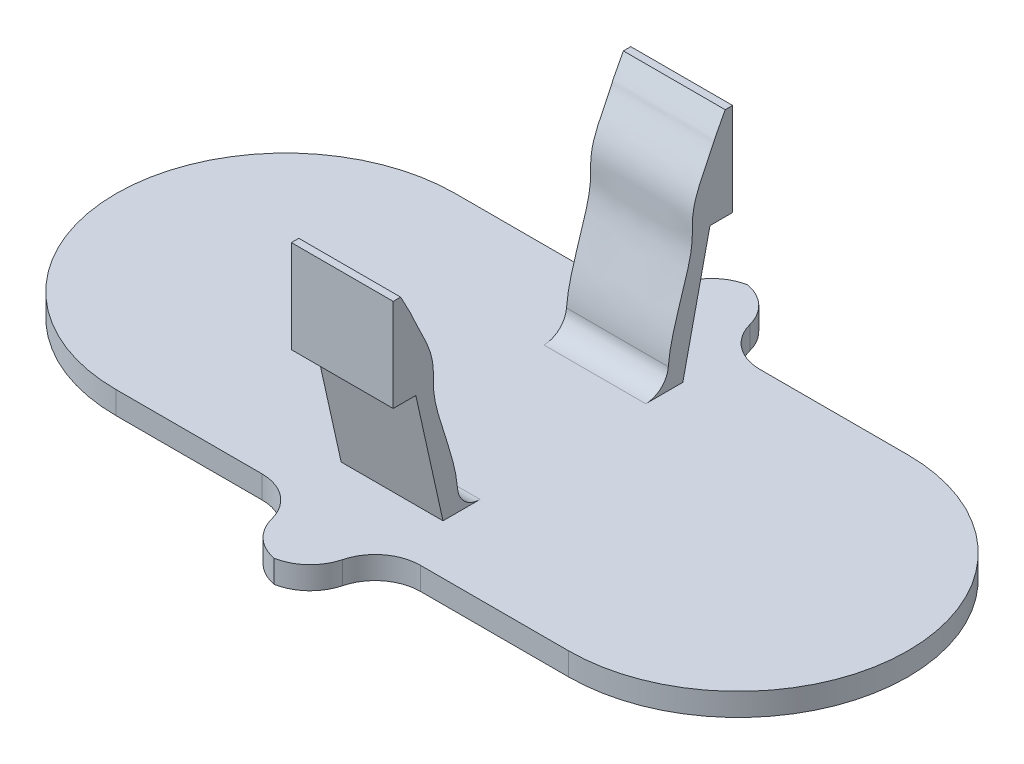
ISO-10303-21;
HEADER;
FILE_DESCRIPTION(('STEP AP214'),'2;1');
FILE_NAME('part.step','',(''),(''),'','','');
FILE_SCHEMA(('AUTOMOTIVE_DESIGN { 1 0 10303 214 1 1 1 1 }'));
ENDSEC;
DATA;
#1=APPLICATION_CONTEXT('core data for automotive mechanical design processes');
#2=APPLICATION_PROTOCOL_DEFINITION('international standard','automotive_design',2000,#1);
#3=PRODUCT_CONTEXT('',#1,'mechanical');
#4=PRODUCT('Part','Part','',(#3));
#5=PRODUCT_RELATED_PRODUCT_CATEGORY('part','',(#4));
#6=PRODUCT_DEFINITION_FORMATION('','',#4);
#7=PRODUCT_DEFINITION_CONTEXT('part definition',#1,'design');
#8=PRODUCT_DEFINITION('design','',#6,#7);
#9=PRODUCT_DEFINITION_SHAPE('','',#8);
#10=(LENGTH_UNIT() NAMED_UNIT(*) SI_UNIT(.MILLI.,.METRE.));
#11=(NAMED_UNIT(*) PLANE_ANGLE_UNIT() SI_UNIT($,.RADIAN.));
#12=(NAMED_UNIT(*) SI_UNIT($,.STERADIAN.) SOLID_ANGLE_UNIT());
#13=UNCERTAINTY_MEASURE_WITH_UNIT(LENGTH_MEASURE(1.E-05),#10,'distance_accuracy_value','');
#14=(GEOMETRIC_REPRESENTATION_CONTEXT(3) GLOBAL_UNCERTAINTY_ASSIGNED_CONTEXT((#13)) GLOBAL_UNIT_ASSIGNED_CONTEXT((#10,
#11,#12)) REPRESENTATION_CONTEXT('',''));
#15=CARTESIAN_POINT('',(0.,0.,0.));
#16=DIRECTION('',(0.,0.,1.));
#17=DIRECTION('',(1.,0.,0.));
#18=AXIS2_PLACEMENT_3D('',#15,#16,#17);
#19=CARTESIAN_POINT('',(0.,1.27,-9.525));
#20=DIRECTION('',(0.,0.,1.));
#21=DIRECTION('',(1.,0.,0.));
#22=AXIS2_PLACEMENT_3D('',#19,#20,#21);
#23=PLANE('',#22);
#24=DIRECTION('',(-1.,0.,0.));
#25=VECTOR('',#24,1.);
#26=CARTESIAN_POINT('',(0.,0.,-9.525));
#27=LINE('',#26,#25);
#28=CARTESIAN_POINT('',(25.4,0.,-9.525));
#29=VERTEX_POINT('',#28);
#30=CARTESIAN_POINT('',(17.0846997691546,0.,-9.525));
#31=VERTEX_POINT('',#30);
#32=EDGE_CURVE('E507',#29,#31,#27,.T.);
#33=ORIENTED_EDGE('',*,*,#32,.T.);
#34=DIRECTION('',(0.,1.,0.));
#35=VECTOR('',#34,1.);
#36=CARTESIAN_POINT('',(17.0846997691546,1.27,-9.525));
#37=LINE('',#36,#35);
#38=CARTESIAN_POINT('',(17.0846997691546,1.27,-9.525));
#39=VERTEX_POINT('',#38);
#40=EDGE_CURVE('E424',#31,#39,#37,.T.);
#41=ORIENTED_EDGE('',*,*,#40,.T.);
#42=DIRECTION('',(-1.,0.,0.));
#43=VECTOR('',#42,1.);
#44=CARTESIAN_POINT('',(0.,1.27,-9.525));
#45=LINE('',#44,#43);
#46=CARTESIAN_POINT('',(25.4,1.27,-9.525));
#47=VERTEX_POINT('',#46);
#48=EDGE_CURVE('E419',#47,#39,#45,.T.);
#49=ORIENTED_EDGE('',*,*,#48,.F.);
#50=DIRECTION('',(0.,-1.,0.));
#51=VECTOR('',#50,1.);
#52=CARTESIAN_POINT('',(25.4,1.27,-9.525));
#53=LINE('',#52,#51);
#54=EDGE_CURVE('E512',#47,#29,#53,.T.);
#55=ORIENTED_EDGE('',*,*,#54,.T.);
#56=EDGE_LOOP('',(#33,#41,#49,#55));
#57=FACE_BOUND('',#56,.T.);
#58=ADVANCED_FACE('F41',(#57),#23,.F.);
#59=CARTESIAN_POINT('',(0.,1.27,9.525));
#60=DIRECTION('',(0.,0.,-1.));
#61=DIRECTION('',(-1.,0.,0.));
#62=AXIS2_PLACEMENT_3D('',#59,#60,#61);
#63=PLANE('',#62);
#64=DIRECTION('',(1.,0.,0.));
#65=VECTOR('',#64,1.);
#66=CARTESIAN_POINT('',(0.,1.27,9.525));
#67=LINE('',#66,#65);
#68=CARTESIAN_POINT('',(17.0846997691546,1.27,9.525));
#69=VERTEX_POINT('',#68);
#70=CARTESIAN_POINT('',(25.4,1.27,9.525));
#71=VERTEX_POINT('',#70);
#72=EDGE_CURVE('E495',#69,#71,#67,.T.);
#73=ORIENTED_EDGE('',*,*,#72,.F.);
#74=DIRECTION('',(0.,1.,0.));
#75=VECTOR('',#74,1.);
#76=CARTESIAN_POINT('',(17.0846997691546,0.,9.525));
#77=LINE('',#76,#75);
#78=CARTESIAN_POINT('',(17.0846997691546,0.,9.525));
#79=VERTEX_POINT('',#78);
#80=EDGE_CURVE('E425',#69,#79,#77,.F.);
#81=ORIENTED_EDGE('',*,*,#80,.T.);
#82=DIRECTION('',(1.,0.,0.));
#83=VECTOR('',#82,1.);
#84=CARTESIAN_POINT('',(0.,0.,9.525));
#85=LINE('',#84,#83);
#86=CARTESIAN_POINT('',(25.4,0.,9.525));
#87=VERTEX_POINT('',#86);
#88=EDGE_CURVE('E505',#79,#87,#85,.T.);
#89=ORIENTED_EDGE('',*,*,#88,.T.);
#90=DIRECTION('',(0.,-1.,0.));
#91=VECTOR('',#90,1.);
#92=CARTESIAN_POINT('',(25.4,1.27,9.525));
#93=LINE('',#92,#91);
#94=EDGE_CURVE('E511',#71,#87,#93,.T.);
#95=ORIENTED_EDGE('',*,*,#94,.F.);
#96=EDGE_LOOP('',(#73,#81,#89,#95));
#97=FACE_BOUND('',#96,.T.);
#98=ADVANCED_FACE('F341',(#97),#63,.F.);
#99=CARTESIAN_POINT('',(0.,0.,9.525));
#100=VERTEX_POINT('',#99);
#101=CARTESIAN_POINT('',(8.19469976915462,0.,9.525));
#102=VERTEX_POINT('',#101);
#103=EDGE_CURVE('E490',#100,#102,#85,.T.);
#104=ORIENTED_EDGE('',*,*,#103,.T.);
#105=DIRECTION('',(0.,-1.,0.));
#106=VECTOR('',#105,1.);
#107=CARTESIAN_POINT('',(8.19469976915462,1.27,9.525));
#108=LINE('',#107,#106);
#109=CARTESIAN_POINT('',(8.19469976915462,1.27,9.525));
#110=VERTEX_POINT('',#109);
#111=EDGE_CURVE('E430',#102,#110,#108,.F.);
#112=ORIENTED_EDGE('',*,*,#111,.T.);
#113=CARTESIAN_POINT('',(0.,1.27,9.525));
#114=VERTEX_POINT('',#113);
#115=EDGE_CURVE('E486',#114,#110,#67,.T.);
#116=ORIENTED_EDGE('',*,*,#115,.F.);
#117=DIRECTION('',(0.,-1.,0.));
#118=VECTOR('',#117,1.);
#119=CARTESIAN_POINT('',(0.,1.27,9.525));
#120=LINE('',#119,#118);
#121=EDGE_CURVE('E520',#114,#100,#120,.T.);
#122=ORIENTED_EDGE('',*,*,#121,.T.);
#123=EDGE_LOOP('',(#104,#112,#116,#122));
#124=FACE_BOUND('',#123,.T.);
#125=ADVANCED_FACE('F350',(#124),#63,.F.);
#126=CARTESIAN_POINT('',(8.19469976915462,1.27,-9.525));
#127=VERTEX_POINT('',#126);
#128=CARTESIAN_POINT('',(0.,1.27,-9.525));
#129=VERTEX_POINT('',#128);
#130=EDGE_CURVE('E409',#127,#129,#45,.T.);
#131=ORIENTED_EDGE('',*,*,#130,.F.);
#132=DIRECTION('',(0.,-1.,0.));
#133=VECTOR('',#132,1.);
#134=CARTESIAN_POINT('',(8.19469976915462,1.27,-9.525));
#135=LINE('',#134,#133);
#136=CARTESIAN_POINT('',(8.19469976915462,0.,-9.525));
#137=VERTEX_POINT('',#136);
#138=EDGE_CURVE('E408',#127,#137,#135,.T.);
#139=ORIENTED_EDGE('',*,*,#138,.T.);
#140=CARTESIAN_POINT('',(0.,0.,-9.525));
#141=VERTEX_POINT('',#140);
#142=EDGE_CURVE('E510',#137,#141,#27,.T.);
#143=ORIENTED_EDGE('',*,*,#142,.T.);
#144=DIRECTION('',(0.,-1.,0.));
#145=VECTOR('',#144,1.);
#146=CARTESIAN_POINT('',(0.,1.27,-9.525));
#147=LINE('',#146,#145);
#148=EDGE_CURVE('E411',#129,#141,#147,.T.);
#149=ORIENTED_EDGE('',*,*,#148,.F.);
#150=EDGE_LOOP('',(#131,#139,#143,#149));
#151=FACE_BOUND('',#150,.T.);
#152=ADVANCED_FACE('F338',(#151),#23,.F.);
#153=CARTESIAN_POINT('',(9.8425,13.335,-9.525));
#154=DIRECTION('',(-1.,0.,0.));
#155=DIRECTION('',(0.,0.,1.));
#156=AXIS2_PLACEMENT_3D('',#153,#154,#155);
#157=PLANE('',#156);
#158=DIRECTION('',(0.,0.,1.));
#159=VECTOR('',#158,1.);
#160=CARTESIAN_POINT('',(9.84249999999999,8.128,-9.52499999999999));
#161=LINE('',#160,#159);
#162=CARTESIAN_POINT('',(9.84249999999999,8.128,-9.52499999999999));
#163=VERTEX_POINT('',#162);
#164=CARTESIAN_POINT('',(9.84249999999999,8.128,-8.25499999999999));
#165=VERTEX_POINT('',#164);
#166=EDGE_CURVE('E237',#163,#165,#161,.T.);
#167=ORIENTED_EDGE('',*,*,#166,.T.);
#168=DIRECTION('',(0.,-0.976187060183953,0.216930457818655));
#169=VECTOR('',#168,1.);
#170=CARTESIAN_POINT('',(9.84249999999999,8.128,-8.25499999999999));
#171=LINE('',#170,#169);
#172=CARTESIAN_POINT('',(9.84249999999999,1.27,-6.731));
#173=VERTEX_POINT('',#172);
#174=EDGE_CURVE('E471',#165,#173,#171,.T.);
#175=ORIENTED_EDGE('',*,*,#174,.T.);
#176=DIRECTION('',(0.,0.,-1.));
#177=VECTOR('',#176,1.);
#178=CARTESIAN_POINT('',(9.8425,1.27,-9.525));
#179=LINE('',#178,#177);
#180=CARTESIAN_POINT('',(9.8425,1.27,-4.64907706808626));
#181=VERTEX_POINT('',#180);
#182=EDGE_CURVE('E234',#181,#173,#179,.T.);
#183=ORIENTED_EDGE('',*,*,#182,.F.);
#184=CARTESIAN_POINT('',(9.8425,2.54,-4.64907706808626));
#185=DIRECTION('',(-1.,0.,0.));
#186=DIRECTION('',(0.,0.,1.));
#187=AXIS2_PLACEMENT_3D('',#184,#185,#186);
#188=CIRCLE('',#187,1.27);
#189=CARTESIAN_POINT('',(9.84249999999999,2.43839368238004,-5.91500603774439));
#190=VERTEX_POINT('',#189);
#191=EDGE_CURVE('E534',#181,#190,#188,.F.);
#192=ORIENTED_EDGE('',*,*,#191,.T.);
#193=CARTESIAN_POINT('',(9.84249999999999,1.27,-5.969));
#194=CARTESIAN_POINT('',(9.84249999999999,3.35043089353243,-5.54932909839416));
#195=CARTESIAN_POINT('',(9.84249999999999,7.25064685998865,-7.78448222967525));
#196=CARTESIAN_POINT('',(9.84249999999999,9.28751002161588,-7.07338084508079));
#197=CARTESIAN_POINT('',(9.84249999999999,12.9691096787113,-8.95242346236543));
#198=CARTESIAN_POINT('',(9.84249999999999,11.3680128075008,-8.05581869586716));
#199=CARTESIAN_POINT('',(9.84249999999999,13.335,-9.10920243861757));
#200=B_SPLINE_CURVE_WITH_KNOTS('',3,(#193,#194,#195,#196,#197,#198,#199),.UNSPECIFIED.,.F.,.F.,
(4,1,1,1,4),(0.,0.483315660922963,0.688146198118413,0.72466418218136,1.),.UNSPECIFIED.);
#201=CARTESIAN_POINT('',(9.84249999999999,13.335,-9.10920243861756));
#202=VERTEX_POINT('',#201);
#203=EDGE_CURVE('E539',#190,#202,#200,.T.);
#204=ORIENTED_EDGE('',*,*,#203,.T.);
#205=DIRECTION('',(0.,0.,-1.));
#206=VECTOR('',#205,1.);
#207=CARTESIAN_POINT('',(9.8425,13.335,-9.525));
#208=LINE('',#207,#206);
#209=CARTESIAN_POINT('',(9.8425,13.335,-9.525));
#210=VERTEX_POINT('',#209);
#211=EDGE_CURVE('E259',#202,#210,#208,.T.);
#212=ORIENTED_EDGE('',*,*,#211,.T.);
#213=DIRECTION('',(0.,-1.,0.));
#214=VECTOR('',#213,1.);
#215=CARTESIAN_POINT('',(9.8425,13.335,-9.525));
#216=LINE('',#215,#214);
#217=EDGE_CURVE('E269',#210,#163,#216,.T.);
#218=ORIENTED_EDGE('',*,*,#217,.T.);
#219=EDGE_LOOP('',(#167,#175,#183,#192,#204,#212,#218));
#220=FACE_BOUND('',#219,.T.);
#221=ADVANCED_FACE('F398',(#220),#157,.T.);
#222=CARTESIAN_POINT('',(0.,13.335,0.));
#223=DIRECTION('',(0.,-1.,0.));
#224=DIRECTION('',(0.,0.,1.));
#225=AXIS2_PLACEMENT_3D('',#222,#223,#224);
#226=PLANE('',#225);
#227=DIRECTION('',(-1.,0.,0.));
#228=VECTOR('',#227,1.);
#229=CARTESIAN_POINT('',(34.926,13.335,-9.10920243861756));
#230=LINE('',#229,#228);
#231=CARTESIAN_POINT('',(15.5575,13.335,-9.10920243861756));
#232=VERTEX_POINT('',#231);
#233=EDGE_CURVE('E258',#232,#202,#230,.T.);
#234=ORIENTED_EDGE('',*,*,#233,.F.);
#235=DIRECTION('',(0.,0.,1.));
#236=VECTOR('',#235,1.);
#237=CARTESIAN_POINT('',(15.5575,13.335,-5.715));
#238=LINE('',#237,#236);
#239=CARTESIAN_POINT('',(15.5575,13.335,-9.525));
#240=VERTEX_POINT('',#239);
#241=EDGE_CURVE('E267',#240,#232,#238,.T.);
#242=ORIENTED_EDGE('',*,*,#241,.F.);
#243=DIRECTION('',(1.,0.,0.));
#244=VECTOR('',#243,1.);
#245=CARTESIAN_POINT('',(15.5575,13.335,-9.525));
#246=LINE('',#245,#244);
#247=EDGE_CURVE('E253',#210,#240,#246,.T.);
#248=ORIENTED_EDGE('',*,*,#247,.F.);
#249=ORIENTED_EDGE('',*,*,#211,.F.);
#250=EDGE_LOOP('',(#234,#242,#248,#249));
#251=FACE_BOUND('',#250,.T.);
#252=ADVANCED_FACE('F334',(#251),#226,.F.);
#253=CARTESIAN_POINT('',(0.,1.27,0.));
#254=DIRECTION('',(0.,1.,0.));
#255=DIRECTION('',(0.,0.,1.));
#256=AXIS2_PLACEMENT_3D('',#253,#254,#255);
#257=PLANE('',#256);
#258=DIRECTION('',(1.,0.,0.));
#259=VECTOR('',#258,1.);
#260=CARTESIAN_POINT('',(9.84249999999999,1.27,-4.64907706808626));
#261=LINE('',#260,#259);
#262=CARTESIAN_POINT('',(15.5575,1.27,-4.64907706808626));
#263=VERTEX_POINT('',#262);
#264=EDGE_CURVE('E525',#263,#181,#261,.F.);
#265=ORIENTED_EDGE('',*,*,#264,.T.);
#266=ORIENTED_EDGE('',*,*,#182,.T.);
#267=DIRECTION('',(-1.,0.,0.));
#268=VECTOR('',#267,1.);
#269=CARTESIAN_POINT('',(34.926,1.27,-6.731));
#270=LINE('',#269,#268);
#271=CARTESIAN_POINT('',(15.5575,1.27,-6.731));
#272=VERTEX_POINT('',#271);
#273=EDGE_CURVE('E228',#272,#173,#270,.T.);
#274=ORIENTED_EDGE('',*,*,#273,.F.);
#275=DIRECTION('',(0.,0.,1.));
#276=VECTOR('',#275,1.);
#277=CARTESIAN_POINT('',(15.5575,1.27,-5.715));
#278=LINE('',#277,#276);
#279=EDGE_CURVE('E235',#272,#263,#278,.T.);
#280=ORIENTED_EDGE('',*,*,#279,.T.);
#281=EDGE_LOOP('',(#265,#266,#274,#280));
#282=FACE_BOUND('',#281,.T.);
#283=DIRECTION('',(0.,0.,1.));
#284=VECTOR('',#283,1.);
#285=CARTESIAN_POINT('',(9.8425,1.27,9.525));
#286=LINE('',#285,#284);
#287=CARTESIAN_POINT('',(9.8425,1.27,4.64907706808626));
#288=VERTEX_POINT('',#287);
#289=CARTESIAN_POINT('',(9.84249999999999,1.27,6.731));
#290=VERTEX_POINT('',#289);
#291=EDGE_CURVE('E614',#288,#290,#286,.T.);
#292=ORIENTED_EDGE('',*,*,#291,.F.);
#293=DIRECTION('',(-1.,0.,0.));
#294=VECTOR('',#293,1.);
#295=CARTESIAN_POINT('',(0.,1.27,4.64907706808626));
#296=LINE('',#295,#294);
#297=CARTESIAN_POINT('',(15.5575,1.27,4.64907706808626));
#298=VERTEX_POINT('',#297);
#299=EDGE_CURVE('E524',#288,#298,#296,.F.);
#300=ORIENTED_EDGE('',*,*,#299,.T.);
#301=DIRECTION('',(0.,0.,-1.));
#302=VECTOR('',#301,1.);
#303=CARTESIAN_POINT('',(15.5575,1.27,5.715));
#304=LINE('',#303,#302);
#305=CARTESIAN_POINT('',(15.5575,1.27,6.731));
#306=VERTEX_POINT('',#305);
#307=EDGE_CURVE('E618',#306,#298,#304,.T.);
#308=ORIENTED_EDGE('',*,*,#307,.F.);
#309=DIRECTION('',(-1.,0.,0.));
#310=VECTOR('',#309,1.);
#311=CARTESIAN_POINT('',(34.926,1.27,6.731));
#312=LINE('',#311,#310);
#313=EDGE_CURVE('E272',#306,#290,#312,.T.);
#314=ORIENTED_EDGE('',*,*,#313,.T.);
#315=EDGE_LOOP('',(#292,#300,#308,#314));
#316=FACE_BOUND('',#315,.T.);
#317=CARTESIAN_POINT('',(17.0846997691546,1.27,-12.065));
#318=DIRECTION('',(0.,1.,0.));
#319=DIRECTION('',(0.,0.,1.));
#320=AXIS2_PLACEMENT_3D('',#317,#318,#319);
#321=CIRCLE('',#320,2.54);
#322=CARTESIAN_POINT('',(14.6253553443129,1.27,-11.43));
#323=VERTEX_POINT('',#322);
#324=EDGE_CURVE('E432',#39,#323,#321,.F.);
#325=ORIENTED_EDGE('',*,*,#324,.T.);
#326=CARTESIAN_POINT('',(12.1660109194712,1.27,-10.795));
#327=DIRECTION('',(0.,1.,0.));
#328=DIRECTION('',(0.,0.,1.));
#329=AXIS2_PLACEMENT_3D('',#326,#327,#328);
#330=CIRCLE('',#329,2.54);
#331=CARTESIAN_POINT('',(12.6396997691546,1.27,-13.2904396153154));
#332=VERTEX_POINT('',#331);
#333=EDGE_CURVE('E459',#323,#332,#330,.T.);
#334=ORIENTED_EDGE('',*,*,#333,.T.);
#335=CARTESIAN_POINT('',(13.113388618838,1.27,-10.795));
#336=DIRECTION('',(0.,1.,0.));
#337=DIRECTION('',(0.,0.,1.));
#338=AXIS2_PLACEMENT_3D('',#335,#336,#337);
#339=CIRCLE('',#338,2.54);
#340=CARTESIAN_POINT('',(10.6540441939963,1.27,-11.43));
#341=VERTEX_POINT('',#340);
#342=EDGE_CURVE('E460',#332,#341,#339,.T.);
#343=ORIENTED_EDGE('',*,*,#342,.T.);
#344=CARTESIAN_POINT('',(8.19469976915462,1.27,-12.065));
#345=DIRECTION('',(0.,1.,0.));
#346=DIRECTION('',(0.,0.,1.));
#347=AXIS2_PLACEMENT_3D('',#344,#345,#346);
#348=CIRCLE('',#347,2.54);
#349=EDGE_CURVE('E423',#341,#127,#348,.F.);
#350=ORIENTED_EDGE('',*,*,#349,.T.);
#351=ORIENTED_EDGE('',*,*,#130,.T.);
#352=CARTESIAN_POINT('',(0.,1.27,0.));
#353=DIRECTION('',(0.,1.,0.));
#354=DIRECTION('',(0.,0.,1.));
#355=AXIS2_PLACEMENT_3D('',#352,#353,#354);
#356=CIRCLE('',#355,9.525);
#357=EDGE_CURVE('E489',#129,#114,#356,.T.);
#358=ORIENTED_EDGE('',*,*,#357,.T.);
#359=ORIENTED_EDGE('',*,*,#115,.T.);
#360=CARTESIAN_POINT('',(8.19469976915462,1.27,12.065));
#361=DIRECTION('',(0.,1.,0.));
#362=DIRECTION('',(0.,0.,1.));
#363=AXIS2_PLACEMENT_3D('',#360,#361,#362);
#364=CIRCLE('',#363,2.54);
#365=CARTESIAN_POINT('',(10.6540441939963,1.27,11.43));
#366=VERTEX_POINT('',#365);
#367=EDGE_CURVE('E450',#110,#366,#364,.F.);
#368=ORIENTED_EDGE('',*,*,#367,.T.);
#369=CARTESIAN_POINT('',(13.113388618838,1.27,10.795));
#370=DIRECTION('',(0.,1.,0.));
#371=DIRECTION('',(0.,0.,1.));
#372=AXIS2_PLACEMENT_3D('',#369,#370,#371);
#373=CIRCLE('',#372,2.54);
#374=CARTESIAN_POINT('',(12.6396997691546,1.27,13.2904396153154));
#375=VERTEX_POINT('',#374);
#376=EDGE_CURVE('E454',#366,#375,#373,.T.);
#377=ORIENTED_EDGE('',*,*,#376,.T.);
#378=CARTESIAN_POINT('',(12.1660109194712,1.27,10.795));
#379=DIRECTION('',(0.,1.,0.));
#380=DIRECTION('',(0.,0.,1.));
#381=AXIS2_PLACEMENT_3D('',#378,#379,#380);
#382=CIRCLE('',#381,2.54);
#383=CARTESIAN_POINT('',(14.6253553443129,1.27,11.43));
#384=VERTEX_POINT('',#383);
#385=EDGE_CURVE('E453',#375,#384,#382,.T.);
#386=ORIENTED_EDGE('',*,*,#385,.T.);
#387=CARTESIAN_POINT('',(17.0846997691546,1.27,12.065));
#388=DIRECTION('',(0.,1.,0.));
#389=DIRECTION('',(0.,0.,1.));
#390=AXIS2_PLACEMENT_3D('',#387,#388,#389);
#391=CIRCLE('',#390,2.54);
#392=EDGE_CURVE('E441',#384,#69,#391,.F.);
#393=ORIENTED_EDGE('',*,*,#392,.T.);
#394=ORIENTED_EDGE('',*,*,#72,.T.);
#395=CARTESIAN_POINT('',(25.4,1.27,0.));
#396=DIRECTION('',(0.,1.,0.));
#397=DIRECTION('',(0.,0.,1.));
#398=AXIS2_PLACEMENT_3D('',#395,#396,#397);
#399=CIRCLE('',#398,9.525);
#400=EDGE_CURVE('E417',#71,#47,#399,.T.);
#401=ORIENTED_EDGE('',*,*,#400,.T.);
#402=ORIENTED_EDGE('',*,*,#48,.T.);
#403=EDGE_LOOP('',(#325,#334,#343,#350,#351,#358,#359,#368,#377,#386,#393,#394,#401,#402));
#404=FACE_BOUND('',#403,.T.);
#405=ADVANCED_FACE('F230',(#282,#316,#404),#257,.T.);
#406=DIRECTION('',(-1.,0.,0.));
#407=VECTOR('',#406,1.);
#408=CARTESIAN_POINT('',(34.926,8.128,9.52499999999999));
#409=LINE('',#408,#407);
#410=CARTESIAN_POINT('',(15.5575,8.128,9.52499999999999));
#411=VERTEX_POINT('',#410);
#412=CARTESIAN_POINT('',(9.84249999999999,8.128,9.52499999999999));
#413=VERTEX_POINT('',#412);
#414=EDGE_CURVE('E275',#411,#413,#409,.T.);
#415=ORIENTED_EDGE('',*,*,#414,.F.);
#416=DIRECTION('',(0.,-1.,0.));
#417=VECTOR('',#416,1.);
#418=CARTESIAN_POINT('',(15.5575,13.335,9.525));
#419=LINE('',#418,#417);
#420=CARTESIAN_POINT('',(15.5575,13.335,9.525));
#421=VERTEX_POINT('',#420);
#422=EDGE_CURVE('E503',#421,#411,#419,.T.);
#423=ORIENTED_EDGE('',*,*,#422,.F.);
#424=DIRECTION('',(1.,0.,0.));
#425=VECTOR('',#424,1.);
#426=CARTESIAN_POINT('',(15.5575,13.335,9.525));
#427=LINE('',#426,#425);
#428=CARTESIAN_POINT('',(9.8425,13.335,9.525));
#429=VERTEX_POINT('',#428);
#430=EDGE_CURVE('E611',#429,#421,#427,.T.);
#431=ORIENTED_EDGE('',*,*,#430,.F.);
#432=DIRECTION('',(0.,-1.,0.));
#433=VECTOR('',#432,1.);
#434=CARTESIAN_POINT('',(9.8425,13.335,9.525));
#435=LINE('',#434,#433);
#436=EDGE_CURVE('E601',#429,#413,#435,.T.);
#437=ORIENTED_EDGE('',*,*,#436,.T.);
#438=EDGE_LOOP('',(#415,#423,#431,#437));
#439=FACE_BOUND('',#438,.T.);
#440=ADVANCED_FACE('F326',(#439),#63,.F.);
#441=CARTESIAN_POINT('',(15.5575,13.335,5.715));
#442=DIRECTION('',(-1.,0.,0.));
#443=DIRECTION('',(0.,0.,1.));
#444=AXIS2_PLACEMENT_3D('',#441,#442,#443);
#445=PLANE('',#444);
#446=DIRECTION('',(0.,0.976187060183953,0.216930457818655));
#447=VECTOR('',#446,1.);
#448=CARTESIAN_POINT('',(15.5575,8.128,8.25499999999999));
#449=LINE('',#448,#447);
#450=CARTESIAN_POINT('',(15.5575,8.128,8.25499999999999));
#451=VERTEX_POINT('',#450);
#452=EDGE_CURVE('E281',#306,#451,#449,.T.);
#453=ORIENTED_EDGE('',*,*,#452,.F.);
#454=ORIENTED_EDGE('',*,*,#307,.T.);
#455=CARTESIAN_POINT('',(15.5575,2.54,4.64907706808626));
#456=DIRECTION('',(-1.,0.,0.));
#457=DIRECTION('',(0.,0.,1.));
#458=AXIS2_PLACEMENT_3D('',#455,#456,#457);
#459=CIRCLE('',#458,1.27);
#460=CARTESIAN_POINT('',(15.5575,2.43839368238004,5.91500603774439));
#461=VERTEX_POINT('',#460);
#462=EDGE_CURVE('E535',#298,#461,#459,.T.);
#463=ORIENTED_EDGE('',*,*,#462,.T.);
#464=CARTESIAN_POINT('',(15.5575,1.27,5.969));
#465=CARTESIAN_POINT('',(15.5575,3.35043089353243,5.54932909839416));
#466=CARTESIAN_POINT('',(15.5575,7.25064685998865,7.78448222967525));
#467=CARTESIAN_POINT('',(15.5575,9.28751002161588,7.07338084508079));
#468=CARTESIAN_POINT('',(15.5575,12.9691096787113,8.95242346236543));
#469=CARTESIAN_POINT('',(15.5575,11.3680128075008,8.05581869586716));
#470=CARTESIAN_POINT('',(15.5575,13.335,9.10920243861757));
#471=B_SPLINE_CURVE_WITH_KNOTS('',3,(#464,#465,#466,#467,#468,#469,#470),.UNSPECIFIED.,.F.,.F.,
(4,1,1,1,4),(0.,0.483315660922963,0.688146198118413,0.72466418218136,1.),.UNSPECIFIED.);
#472=CARTESIAN_POINT('',(15.5575,13.335,9.10920243861756));
#473=VERTEX_POINT('',#472);
#474=EDGE_CURVE('E287',#473,#461,#471,.F.);
#475=ORIENTED_EDGE('',*,*,#474,.F.);
#476=DIRECTION('',(0.,0.,-1.));
#477=VECTOR('',#476,1.);
#478=CARTESIAN_POINT('',(15.5575,13.335,5.715));
#479=LINE('',#478,#477);
#480=EDGE_CURVE('E610',#421,#473,#479,.T.);
#481=ORIENTED_EDGE('',*,*,#480,.F.);
#482=ORIENTED_EDGE('',*,*,#422,.T.);
#483=DIRECTION('',(0.,0.,1.));
#484=VECTOR('',#483,1.);
#485=CARTESIAN_POINT('',(15.5575,8.128,9.52499999999999));
#486=LINE('',#485,#484);
#487=EDGE_CURVE('E288',#451,#411,#486,.T.);
#488=ORIENTED_EDGE('',*,*,#487,.F.);
#489=EDGE_LOOP('',(#453,#454,#463,#475,#481,#482,#488));
#490=FACE_BOUND('',#489,.T.);
#491=ADVANCED_FACE('F321',(#490),#445,.F.);
#492=CARTESIAN_POINT('',(9.8425,13.335,9.525));
#493=DIRECTION('',(1.,0.,0.));
#494=DIRECTION('',(0.,0.,-1.));
#495=AXIS2_PLACEMENT_3D('',#492,#493,#494);
#496=PLANE('',#495);
#497=DIRECTION('',(0.,0.,-1.));
#498=VECTOR('',#497,1.);
#499=CARTESIAN_POINT('',(9.84249999999999,8.128,9.52499999999999));
#500=LINE('',#499,#498);
#501=CARTESIAN_POINT('',(9.84249999999999,8.128,8.25499999999999));
#502=VERTEX_POINT('',#501);
#503=EDGE_CURVE('E283',#413,#502,#500,.T.);
#504=ORIENTED_EDGE('',*,*,#503,.F.);
#505=ORIENTED_EDGE('',*,*,#436,.F.);
#506=DIRECTION('',(0.,0.,1.));
#507=VECTOR('',#506,1.);
#508=CARTESIAN_POINT('',(9.8425,13.335,9.525));
#509=LINE('',#508,#507);
#510=CARTESIAN_POINT('',(9.8425,13.335,9.10920243861756));
#511=VERTEX_POINT('',#510);
#512=EDGE_CURVE('E609',#511,#429,#509,.T.);
#513=ORIENTED_EDGE('',*,*,#512,.F.);
#514=CARTESIAN_POINT('',(9.84249999999999,1.27,5.969));
#515=CARTESIAN_POINT('',(9.84249999999999,3.35043089353243,5.54932909839416));
#516=CARTESIAN_POINT('',(9.84249999999999,7.25064685998865,7.78448222967525));
#517=CARTESIAN_POINT('',(9.84249999999999,9.28751002161588,7.07338084508079));
#518=CARTESIAN_POINT('',(9.84249999999999,12.9691096787113,8.95242346236543));
#519=CARTESIAN_POINT('',(9.84249999999999,11.3680128075008,8.05581869586716));
#520=CARTESIAN_POINT('',(9.84249999999999,13.335,9.10920243861757));
#521=B_SPLINE_CURVE_WITH_KNOTS('',3,(#514,#515,#516,#517,#518,#519,#520),.UNSPECIFIED.,.F.,.F.,
(4,1,1,1,4),(0.,0.483315660922963,0.688146198118413,0.72466418218136,1.),.UNSPECIFIED.);
#522=CARTESIAN_POINT('',(9.84249999999999,2.43839368238004,5.91500603774439));
#523=VERTEX_POINT('',#522);
#524=EDGE_CURVE('E291',#523,#511,#521,.T.);
#525=ORIENTED_EDGE('',*,*,#524,.F.);
#526=CARTESIAN_POINT('',(9.8425,2.54,4.64907706808626));
#527=DIRECTION('',(1.,0.,0.));
#528=DIRECTION('',(0.,0.,-1.));
#529=AXIS2_PLACEMENT_3D('',#526,#527,#528);
#530=CIRCLE('',#529,1.27);
#531=EDGE_CURVE('E530',#523,#288,#530,.T.);
#532=ORIENTED_EDGE('',*,*,#531,.T.);
#533=ORIENTED_EDGE('',*,*,#291,.T.);
#534=DIRECTION('',(0.,-0.976187060183953,-0.216930457818655));
#535=VECTOR('',#534,1.);
#536=CARTESIAN_POINT('',(9.84249999999999,8.128,8.25499999999999));
#537=LINE('',#536,#535);
#538=EDGE_CURVE('E274',#502,#290,#537,.T.);
#539=ORIENTED_EDGE('',*,*,#538,.F.);
#540=EDGE_LOOP('',(#504,#505,#513,#525,#532,#533,#539));
#541=FACE_BOUND('',#540,.T.);
#542=ADVANCED_FACE('F318',(#541),#496,.F.);
#543=CARTESIAN_POINT('',(0.,1.27,0.));
#544=DIRECTION('',(0.,-1.,0.));
#545=DIRECTION('',(0.,0.,-1.));
#546=AXIS2_PLACEMENT_3D('',#543,#544,#545);
#547=CYLINDRICAL_SURFACE('',#546,9.525);
#548=CARTESIAN_POINT('',(0.,0.,0.));
#549=DIRECTION('',(0.,1.,0.));
#550=DIRECTION('',(0.,0.,1.));
#551=AXIS2_PLACEMENT_3D('',#548,#549,#550);
#552=CIRCLE('',#551,9.525);
#553=EDGE_CURVE('E497',#141,#100,#552,.T.);
#554=ORIENTED_EDGE('',*,*,#553,.T.);
#555=ORIENTED_EDGE('',*,*,#121,.F.);
#556=ORIENTED_EDGE('',*,*,#357,.F.);
#557=ORIENTED_EDGE('',*,*,#148,.T.);
#558=EDGE_LOOP('',(#554,#555,#556,#557));
#559=FACE_BOUND('',#558,.T.);
#560=ADVANCED_FACE('F324',(#559),#547,.T.);
#561=CARTESIAN_POINT('',(25.4,1.27,0.));
#562=DIRECTION('',(0.,-1.,0.));
#563=DIRECTION('',(0.,0.,-1.));
#564=AXIS2_PLACEMENT_3D('',#561,#562,#563);
#565=CYLINDRICAL_SURFACE('',#564,9.525);
#566=CARTESIAN_POINT('',(25.4,0.,0.));
#567=DIRECTION('',(0.,1.,0.));
#568=DIRECTION('',(0.,0.,1.));
#569=AXIS2_PLACEMENT_3D('',#566,#567,#568);
#570=CIRCLE('',#569,9.525);
#571=EDGE_CURVE('E504',#87,#29,#570,.T.);
#572=ORIENTED_EDGE('',*,*,#571,.T.);
#573=ORIENTED_EDGE('',*,*,#54,.F.);
#574=ORIENTED_EDGE('',*,*,#400,.F.);
#575=ORIENTED_EDGE('',*,*,#94,.T.);
#576=EDGE_LOOP('',(#572,#573,#574,#575));
#577=FACE_BOUND('',#576,.T.);
#578=ADVANCED_FACE('F336',(#577),#565,.T.);
#579=DIRECTION('',(0.,-1.,0.));
#580=VECTOR('',#579,1.);
#581=CARTESIAN_POINT('',(15.5575,13.335,-9.525));
#582=LINE('',#581,#580);
#583=CARTESIAN_POINT('',(15.5575,8.128,-9.52499999999999));
#584=VERTEX_POINT('',#583);
#585=EDGE_CURVE('E264',#240,#584,#582,.T.);
#586=ORIENTED_EDGE('',*,*,#585,.T.);
#587=DIRECTION('',(-1.,0.,0.));
#588=VECTOR('',#587,1.);
#589=CARTESIAN_POINT('',(34.926,8.128,-9.52499999999999));
#590=LINE('',#589,#588);
#591=EDGE_CURVE('E247',#584,#163,#590,.T.);
#592=ORIENTED_EDGE('',*,*,#591,.T.);
#593=ORIENTED_EDGE('',*,*,#217,.F.);
#594=ORIENTED_EDGE('',*,*,#247,.T.);
#595=EDGE_LOOP('',(#586,#592,#593,#594));
#596=FACE_BOUND('',#595,.T.);
#597=ADVANCED_FACE('F331',(#596),#23,.F.);
#598=CARTESIAN_POINT('',(0.,0.,0.));
#599=DIRECTION('',(0.,1.,0.));
#600=DIRECTION('',(0.,0.,1.));
#601=AXIS2_PLACEMENT_3D('',#598,#599,#600);
#602=PLANE('',#601);
#603=CARTESIAN_POINT('',(13.113388618838,0.,-10.795));
#604=DIRECTION('',(0.,1.,0.));
#605=DIRECTION('',(0.,0.,1.));
#606=AXIS2_PLACEMENT_3D('',#603,#604,#605);
#607=CIRCLE('',#606,2.54);
#608=CARTESIAN_POINT('',(10.6540441939963,0.,-11.43));
#609=VERTEX_POINT('',#608);
#610=CARTESIAN_POINT('',(12.6396997691546,0.,-13.2904396153154));
#611=VERTEX_POINT('',#610);
#612=EDGE_CURVE('E59',#609,#611,#607,.F.);
#613=ORIENTED_EDGE('',*,*,#612,.T.);
#614=CARTESIAN_POINT('',(12.1660109194712,0.,-10.795));
#615=DIRECTION('',(0.,1.,0.));
#616=DIRECTION('',(0.,0.,1.));
#617=AXIS2_PLACEMENT_3D('',#614,#615,#616);
#618=CIRCLE('',#617,2.54);
#619=CARTESIAN_POINT('',(14.6253553443129,0.,-11.43));
#620=VERTEX_POINT('',#619);
#621=EDGE_CURVE('E461',#611,#620,#618,.F.);
#622=ORIENTED_EDGE('',*,*,#621,.T.);
#623=CARTESIAN_POINT('',(17.0846997691546,0.,-12.065));
#624=DIRECTION('',(0.,1.,0.));
#625=DIRECTION('',(0.,0.,1.));
#626=AXIS2_PLACEMENT_3D('',#623,#624,#625);
#627=CIRCLE('',#626,2.54);
#628=EDGE_CURVE('E440',#620,#31,#627,.T.);
#629=ORIENTED_EDGE('',*,*,#628,.T.);
#630=ORIENTED_EDGE('',*,*,#32,.F.);
#631=ORIENTED_EDGE('',*,*,#571,.F.);
#632=ORIENTED_EDGE('',*,*,#88,.F.);
#633=CARTESIAN_POINT('',(17.0846997691546,0.,12.065));
#634=DIRECTION('',(0.,1.,0.));
#635=DIRECTION('',(0.,0.,1.));
#636=AXIS2_PLACEMENT_3D('',#633,#634,#635);
#637=CIRCLE('',#636,2.54);
#638=CARTESIAN_POINT('',(14.6253553443129,0.,11.43));
#639=VERTEX_POINT('',#638);
#640=EDGE_CURVE('E442',#79,#639,#637,.T.);
#641=ORIENTED_EDGE('',*,*,#640,.T.);
#642=CARTESIAN_POINT('',(12.1660109194712,0.,10.795));
#643=DIRECTION('',(0.,1.,0.));
#644=DIRECTION('',(0.,0.,1.));
#645=AXIS2_PLACEMENT_3D('',#642,#643,#644);
#646=CIRCLE('',#645,2.54);
#647=CARTESIAN_POINT('',(12.6396997691546,0.,13.2904396153154));
#648=VERTEX_POINT('',#647);
#649=EDGE_CURVE('E63',#639,#648,#646,.F.);
#650=ORIENTED_EDGE('',*,*,#649,.T.);
#651=CARTESIAN_POINT('',(13.113388618838,0.,10.795));
#652=DIRECTION('',(0.,1.,0.));
#653=DIRECTION('',(0.,0.,1.));
#654=AXIS2_PLACEMENT_3D('',#651,#652,#653);
#655=CIRCLE('',#654,2.54);
#656=CARTESIAN_POINT('',(10.6540441939963,0.,11.43));
#657=VERTEX_POINT('',#656);
#658=EDGE_CURVE('E463',#648,#657,#655,.F.);
#659=ORIENTED_EDGE('',*,*,#658,.T.);
#660=CARTESIAN_POINT('',(8.19469976915462,0.,12.065));
#661=DIRECTION('',(0.,1.,0.));
#662=DIRECTION('',(0.,0.,1.));
#663=AXIS2_PLACEMENT_3D('',#660,#661,#662);
#664=CIRCLE('',#663,2.54);
#665=EDGE_CURVE('E444',#657,#102,#664,.T.);
#666=ORIENTED_EDGE('',*,*,#665,.T.);
#667=ORIENTED_EDGE('',*,*,#103,.F.);
#668=ORIENTED_EDGE('',*,*,#553,.F.);
#669=ORIENTED_EDGE('',*,*,#142,.F.);
#670=CARTESIAN_POINT('',(8.19469976915462,0.,-12.065));
#671=DIRECTION('',(0.,1.,0.));
#672=DIRECTION('',(0.,0.,1.));
#673=AXIS2_PLACEMENT_3D('',#670,#671,#672);
#674=CIRCLE('',#673,2.54);
#675=EDGE_CURVE('E421',#137,#609,#674,.T.);
#676=ORIENTED_EDGE('',*,*,#675,.T.);
#677=EDGE_LOOP('',(#613,#622,#629,#630,#631,#632,#641,#650,#659,#666,#667,#668,#669,#676));
#678=FACE_BOUND('',#677,.T.);
#679=ADVANCED_FACE('F319',(#678),#602,.F.);
#680=CARTESIAN_POINT('',(0.,13.335,0.));
#681=DIRECTION('',(0.,-1.,0.));
#682=DIRECTION('',(0.,0.,-1.));
#683=AXIS2_PLACEMENT_3D('',#680,#681,#682);
#684=PLANE('',#683);
#685=ORIENTED_EDGE('',*,*,#480,.T.);
#686=DIRECTION('',(-1.,0.,0.));
#687=VECTOR('',#686,1.);
#688=CARTESIAN_POINT('',(34.926,13.335,9.10920243861756));
#689=LINE('',#688,#687);
#690=EDGE_CURVE('E616',#473,#511,#689,.T.);
#691=ORIENTED_EDGE('',*,*,#690,.T.);
#692=ORIENTED_EDGE('',*,*,#512,.T.);
#693=ORIENTED_EDGE('',*,*,#430,.T.);
#694=EDGE_LOOP('',(#685,#691,#692,#693));
#695=FACE_BOUND('',#694,.T.);
#696=ADVANCED_FACE('F312',(#695),#684,.F.);
#697=CARTESIAN_POINT('',(34.926,1.27,5.969));
#698=CARTESIAN_POINT('',(34.926,3.35043089353243,5.54932909839416));
#699=CARTESIAN_POINT('',(34.926,7.25064685998865,7.78448222967525));
#700=CARTESIAN_POINT('',(34.926,9.28751002161588,7.07338084508079));
#701=CARTESIAN_POINT('',(34.926,12.9691096787113,8.95242346236543));
#702=CARTESIAN_POINT('',(34.926,11.3680128075008,8.05581869586716));
#703=CARTESIAN_POINT('',(34.926,13.335,9.10920243861757));
#704=B_SPLINE_CURVE_WITH_KNOTS('',3,(#697,#698,#699,#700,#701,#702,#703),.UNSPECIFIED.,.F.,.F.,
(4,1,1,1,4),(0.,0.483315660922963,0.688146198118413,0.72466418218136,1.),.UNSPECIFIED.);
#705=DIRECTION('',(-1.,0.,0.));
#706=VECTOR('',#705,1.);
#707=SURFACE_OF_LINEAR_EXTRUSION('',#704,#706);
#708=ORIENTED_EDGE('',*,*,#474,.T.);
#709=DIRECTION('',(-1.,0.,0.));
#710=VECTOR('',#709,1.);
#711=CARTESIAN_POINT('',(15.5575,2.43839368238002,5.91500603774439));
#712=LINE('',#711,#710);
#713=EDGE_CURVE('E516',#461,#523,#712,.T.);
#714=ORIENTED_EDGE('',*,*,#713,.T.);
#715=ORIENTED_EDGE('',*,*,#524,.T.);
#716=ORIENTED_EDGE('',*,*,#690,.F.);
#717=EDGE_LOOP('',(#708,#714,#715,#716));
#718=FACE_BOUND('',#717,.T.);
#719=ADVANCED_FACE('F308',(#718),#707,.F.);
#720=CARTESIAN_POINT('',(34.926,8.128,8.25499999999999));
#721=DIRECTION('',(0.,0.216930457818655,-0.976187060183953));
#722=DIRECTION('',(0.,0.976187060183953,0.216930457818655));
#723=AXIS2_PLACEMENT_3D('',#720,#721,#722);
#724=PLANE('',#723);
#725=ORIENTED_EDGE('',*,*,#452,.T.);
#726=DIRECTION('',(-1.,0.,0.));
#727=VECTOR('',#726,1.);
#728=CARTESIAN_POINT('',(34.926,8.128,8.25499999999999));
#729=LINE('',#728,#727);
#730=EDGE_CURVE('E273',#451,#502,#729,.T.);
#731=ORIENTED_EDGE('',*,*,#730,.T.);
#732=ORIENTED_EDGE('',*,*,#538,.T.);
#733=ORIENTED_EDGE('',*,*,#313,.F.);
#734=EDGE_LOOP('',(#725,#731,#732,#733));
#735=FACE_BOUND('',#734,.T.);
#736=ADVANCED_FACE('F315',(#735),#724,.F.);
#737=CARTESIAN_POINT('',(34.926,8.128,9.52499999999999));
#738=DIRECTION('',(0.,1.,0.));
#739=DIRECTION('',(0.,0.,1.));
#740=AXIS2_PLACEMENT_3D('',#737,#738,#739);
#741=PLANE('',#740);
#742=ORIENTED_EDGE('',*,*,#487,.T.);
#743=ORIENTED_EDGE('',*,*,#414,.T.);
#744=ORIENTED_EDGE('',*,*,#503,.T.);
#745=ORIENTED_EDGE('',*,*,#730,.F.);
#746=EDGE_LOOP('',(#742,#743,#744,#745));
#747=FACE_BOUND('',#746,.T.);
#748=ADVANCED_FACE('F590',(#747),#741,.F.);
#749=CARTESIAN_POINT('',(15.5575,13.335,-5.715));
#750=DIRECTION('',(1.,0.,0.));
#751=DIRECTION('',(0.,0.,-1.));
#752=AXIS2_PLACEMENT_3D('',#749,#750,#751);
#753=PLANE('',#752);
#754=DIRECTION('',(0.,0.,1.));
#755=VECTOR('',#754,1.);
#756=CARTESIAN_POINT('',(15.5575,8.128,-9.52499999999999));
#757=LINE('',#756,#755);
#758=CARTESIAN_POINT('',(15.5575,8.128,-8.25499999999999));
#759=VERTEX_POINT('',#758);
#760=EDGE_CURVE('E475',#584,#759,#757,.T.);
#761=ORIENTED_EDGE('',*,*,#760,.F.);
#762=ORIENTED_EDGE('',*,*,#585,.F.);
#763=ORIENTED_EDGE('',*,*,#241,.T.);
#764=CARTESIAN_POINT('',(15.5575,1.27,-5.969));
#765=CARTESIAN_POINT('',(15.5575,3.35043089353243,-5.54932909839416));
#766=CARTESIAN_POINT('',(15.5575,7.25064685998865,-7.78448222967525));
#767=CARTESIAN_POINT('',(15.5575,9.28751002161588,-7.07338084508079));
#768=CARTESIAN_POINT('',(15.5575,12.9691096787113,-8.95242346236543));
#769=CARTESIAN_POINT('',(15.5575,11.3680128075008,-8.05581869586716));
#770=CARTESIAN_POINT('',(15.5575,13.335,-9.10920243861757));
#771=B_SPLINE_CURVE_WITH_KNOTS('',3,(#764,#765,#766,#767,#768,#769,#770),.UNSPECIFIED.,.F.,.F.,
(4,1,1,1,4),(0.,0.483315660922963,0.688146198118413,0.72466418218136,1.),.UNSPECIFIED.);
#772=CARTESIAN_POINT('',(15.5575,2.43839368238004,-5.91500603774439));
#773=VERTEX_POINT('',#772);
#774=EDGE_CURVE('E250',#773,#232,#771,.T.);
#775=ORIENTED_EDGE('',*,*,#774,.F.);
#776=CARTESIAN_POINT('',(15.5575,2.54,-4.64907706808626));
#777=DIRECTION('',(1.,0.,0.));
#778=DIRECTION('',(0.,0.,-1.));
#779=AXIS2_PLACEMENT_3D('',#776,#777,#778);
#780=CIRCLE('',#779,1.27);
#781=EDGE_CURVE('E254',#773,#263,#780,.F.);
#782=ORIENTED_EDGE('',*,*,#781,.T.);
#783=ORIENTED_EDGE('',*,*,#279,.F.);
#784=DIRECTION('',(0.,-0.976187060183953,0.216930457818655));
#785=VECTOR('',#784,1.);
#786=CARTESIAN_POINT('',(15.5575,8.128,-8.25499999999999));
#787=LINE('',#786,#785);
#788=EDGE_CURVE('E243',#759,#272,#787,.T.);
#789=ORIENTED_EDGE('',*,*,#788,.F.);
#790=EDGE_LOOP('',(#761,#762,#763,#775,#782,#783,#789));
#791=FACE_BOUND('',#790,.T.);
#792=ADVANCED_FACE('F249',(#791),#753,.T.);
#793=CARTESIAN_POINT('',(34.926,1.27,-5.969));
#794=CARTESIAN_POINT('',(34.926,3.35043089353243,-5.54932909839416));
#795=CARTESIAN_POINT('',(34.926,7.25064685998865,-7.78448222967525));
#796=CARTESIAN_POINT('',(34.926,9.28751002161588,-7.07338084508079));
#797=CARTESIAN_POINT('',(34.926,12.9691096787113,-8.95242346236543));
#798=CARTESIAN_POINT('',(34.926,11.3680128075008,-8.05581869586716));
#799=CARTESIAN_POINT('',(34.926,13.335,-9.10920243861757));
#800=B_SPLINE_CURVE_WITH_KNOTS('',3,(#793,#794,#795,#796,#797,#798,#799),.UNSPECIFIED.,.F.,.F.,
(4,1,1,1,4),(0.,0.483315660922963,0.688146198118413,0.72466418218136,1.),.UNSPECIFIED.);
#801=DIRECTION('',(-1.,0.,0.));
#802=VECTOR('',#801,1.);
#803=SURFACE_OF_LINEAR_EXTRUSION('',#800,#802);
#804=ORIENTED_EDGE('',*,*,#203,.F.);
#805=DIRECTION('',(-1.,0.,0.));
#806=VECTOR('',#805,1.);
#807=CARTESIAN_POINT('',(9.84249999999999,2.43839368238002,-5.91500603774439));
#808=LINE('',#807,#806);
#809=EDGE_CURVE('E529',#190,#773,#808,.F.);
#810=ORIENTED_EDGE('',*,*,#809,.T.);
#811=ORIENTED_EDGE('',*,*,#774,.T.);
#812=ORIENTED_EDGE('',*,*,#233,.T.);
#813=EDGE_LOOP('',(#804,#810,#811,#812));
#814=FACE_BOUND('',#813,.T.);
#815=ADVANCED_FACE('F545',(#814),#803,.T.);
#816=CARTESIAN_POINT('',(34.926,8.128,-9.52499999999999));
#817=DIRECTION('',(0.,-1.,0.));
#818=DIRECTION('',(0.,0.,-1.));
#819=AXIS2_PLACEMENT_3D('',#816,#817,#818);
#820=PLANE('',#819);
#821=ORIENTED_EDGE('',*,*,#760,.T.);
#822=DIRECTION('',(-1.,0.,0.));
#823=VECTOR('',#822,1.);
#824=CARTESIAN_POINT('',(34.926,8.128,-8.25499999999999));
#825=LINE('',#824,#823);
#826=EDGE_CURVE('E238',#759,#165,#825,.T.);
#827=ORIENTED_EDGE('',*,*,#826,.T.);
#828=ORIENTED_EDGE('',*,*,#166,.F.);
#829=ORIENTED_EDGE('',*,*,#591,.F.);
#830=EDGE_LOOP('',(#821,#827,#828,#829));
#831=FACE_BOUND('',#830,.T.);
#832=ADVANCED_FACE('F573',(#831),#820,.T.);
#833=CARTESIAN_POINT('',(34.926,8.128,-8.25499999999999));
#834=DIRECTION('',(0.,-0.216930457818655,-0.976187060183953));
#835=DIRECTION('',(0.,0.976187060183953,-0.216930457818655));
#836=AXIS2_PLACEMENT_3D('',#833,#834,#835);
#837=PLANE('',#836);
#838=ORIENTED_EDGE('',*,*,#788,.T.);
#839=ORIENTED_EDGE('',*,*,#273,.T.);
#840=ORIENTED_EDGE('',*,*,#174,.F.);
#841=ORIENTED_EDGE('',*,*,#826,.F.);
#842=EDGE_LOOP('',(#838,#839,#840,#841));
#843=FACE_BOUND('',#842,.T.);
#844=ADVANCED_FACE('F242',(#843),#837,.T.);
#845=CARTESIAN_POINT('',(12.7,2.54,4.64907706808626));
#846=DIRECTION('',(-1.,0.,0.));
#847=DIRECTION('',(0.,0.,1.));
#848=AXIS2_PLACEMENT_3D('',#845,#846,#847);
#849=CYLINDRICAL_SURFACE('',#848,1.27);
#850=ORIENTED_EDGE('',*,*,#462,.F.);
#851=ORIENTED_EDGE('',*,*,#299,.F.);
#852=ORIENTED_EDGE('',*,*,#531,.F.);
#853=ORIENTED_EDGE('',*,*,#713,.F.);
#854=EDGE_LOOP('',(#850,#851,#852,#853));
#855=FACE_BOUND('',#854,.T.);
#856=ADVANCED_FACE('F354',(#855),#849,.F.);
#857=CARTESIAN_POINT('',(12.7,2.54,-4.64907706808626));
#858=DIRECTION('',(-1.,0.,0.));
#859=DIRECTION('',(0.,0.,1.));
#860=AXIS2_PLACEMENT_3D('',#857,#858,#859);
#861=CYLINDRICAL_SURFACE('',#860,1.27);
#862=ORIENTED_EDGE('',*,*,#781,.F.);
#863=ORIENTED_EDGE('',*,*,#809,.F.);
#864=ORIENTED_EDGE('',*,*,#191,.F.);
#865=ORIENTED_EDGE('',*,*,#264,.F.);
#866=EDGE_LOOP('',(#862,#863,#864,#865));
#867=FACE_BOUND('',#866,.T.);
#868=ADVANCED_FACE('F351',(#867),#861,.F.);
#869=CARTESIAN_POINT('',(17.0846997691546,1.27,-12.065));
#870=DIRECTION('',(0.,1.,0.));
#871=DIRECTION('',(0.,0.,1.));
#872=AXIS2_PLACEMENT_3D('',#869,#870,#871);
#873=CYLINDRICAL_SURFACE('',#872,2.54);
#874=ORIENTED_EDGE('',*,*,#628,.F.);
#875=DIRECTION('',(0.,1.,0.));
#876=VECTOR('',#875,1.);
#877=CARTESIAN_POINT('',(14.6253553443129,1.27,-11.43));
#878=LINE('',#877,#876);
#879=EDGE_CURVE('E448',#620,#323,#878,.T.);
#880=ORIENTED_EDGE('',*,*,#879,.T.);
#881=ORIENTED_EDGE('',*,*,#324,.F.);
#882=ORIENTED_EDGE('',*,*,#40,.F.);
#883=EDGE_LOOP('',(#874,#880,#881,#882));
#884=FACE_BOUND('',#883,.T.);
#885=ADVANCED_FACE('F360',(#884),#873,.F.);
#886=CARTESIAN_POINT('',(8.19469976915462,1.27,-12.065));
#887=DIRECTION('',(0.,-1.,0.));
#888=DIRECTION('',(0.,0.,-1.));
#889=AXIS2_PLACEMENT_3D('',#886,#887,#888);
#890=CYLINDRICAL_SURFACE('',#889,2.54);
#891=ORIENTED_EDGE('',*,*,#349,.F.);
#892=DIRECTION('',(0.,-1.,0.));
#893=VECTOR('',#892,1.);
#894=CARTESIAN_POINT('',(10.6540441939963,1.27,-11.43));
#895=LINE('',#894,#893);
#896=EDGE_CURVE('E470',#341,#609,#895,.T.);
#897=ORIENTED_EDGE('',*,*,#896,.T.);
#898=ORIENTED_EDGE('',*,*,#675,.F.);
#899=ORIENTED_EDGE('',*,*,#138,.F.);
#900=EDGE_LOOP('',(#891,#897,#898,#899));
#901=FACE_BOUND('',#900,.T.);
#902=ADVANCED_FACE('F361',(#901),#890,.F.);
#903=CARTESIAN_POINT('',(17.0846997691546,1.27,12.065));
#904=DIRECTION('',(0.,-1.,0.));
#905=DIRECTION('',(0.,0.,-1.));
#906=AXIS2_PLACEMENT_3D('',#903,#904,#905);
#907=CYLINDRICAL_SURFACE('',#906,2.54);
#908=ORIENTED_EDGE('',*,*,#392,.F.);
#909=DIRECTION('',(0.,-1.,0.));
#910=VECTOR('',#909,1.);
#911=CARTESIAN_POINT('',(14.6253553443129,1.27,11.43));
#912=LINE('',#911,#910);
#913=EDGE_CURVE('E49',#384,#639,#912,.T.);
#914=ORIENTED_EDGE('',*,*,#913,.T.);
#915=ORIENTED_EDGE('',*,*,#640,.F.);
#916=ORIENTED_EDGE('',*,*,#80,.F.);
#917=EDGE_LOOP('',(#908,#914,#915,#916));
#918=FACE_BOUND('',#917,.T.);
#919=ADVANCED_FACE('F370',(#918),#907,.F.);
#920=CARTESIAN_POINT('',(8.19469976915462,1.27,12.065));
#921=DIRECTION('',(0.,1.,0.));
#922=DIRECTION('',(0.,0.,1.));
#923=AXIS2_PLACEMENT_3D('',#920,#921,#922);
#924=CYLINDRICAL_SURFACE('',#923,2.54);
#925=ORIENTED_EDGE('',*,*,#665,.F.);
#926=DIRECTION('',(0.,1.,0.));
#927=VECTOR('',#926,1.);
#928=CARTESIAN_POINT('',(10.6540441939963,1.27,11.43));
#929=LINE('',#928,#927);
#930=EDGE_CURVE('E11',#657,#366,#929,.T.);
#931=ORIENTED_EDGE('',*,*,#930,.T.);
#932=ORIENTED_EDGE('',*,*,#367,.F.);
#933=ORIENTED_EDGE('',*,*,#111,.F.);
#934=EDGE_LOOP('',(#925,#931,#932,#933));
#935=FACE_BOUND('',#934,.T.);
#936=ADVANCED_FACE('F371',(#935),#924,.F.);
#937=CARTESIAN_POINT('',(13.113388618838,1.27,-10.795));
#938=DIRECTION('',(0.,-1.,0.));
#939=DIRECTION('',(0.,0.,-1.));
#940=AXIS2_PLACEMENT_3D('',#937,#938,#939);
#941=CYLINDRICAL_SURFACE('',#940,2.54);
#942=DIRECTION('',(0.,-1.,0.));
#943=VECTOR('',#942,1.);
#944=CARTESIAN_POINT('',(12.6396997691546,0.635,-13.2904396153154));
#945=LINE('',#944,#943);
#946=EDGE_CURVE('E468',#611,#332,#945,.F.);
#947=ORIENTED_EDGE('',*,*,#946,.F.);
#948=ORIENTED_EDGE('',*,*,#612,.F.);
#949=ORIENTED_EDGE('',*,*,#896,.F.);
#950=ORIENTED_EDGE('',*,*,#342,.F.);
#951=EDGE_LOOP('',(#947,#948,#949,#950));
#952=FACE_BOUND('',#951,.T.);
#953=ADVANCED_FACE('F374',(#952),#941,.T.);
#954=CARTESIAN_POINT('',(12.1660109194712,1.27,-10.795));
#955=DIRECTION('',(0.,1.,0.));
#956=DIRECTION('',(0.,0.,1.));
#957=AXIS2_PLACEMENT_3D('',#954,#955,#956);
#958=CYLINDRICAL_SURFACE('',#957,2.54);
#959=ORIENTED_EDGE('',*,*,#621,.F.);
#960=ORIENTED_EDGE('',*,*,#946,.T.);
#961=ORIENTED_EDGE('',*,*,#333,.F.);
#962=ORIENTED_EDGE('',*,*,#879,.F.);
#963=EDGE_LOOP('',(#959,#960,#961,#962));
#964=FACE_BOUND('',#963,.T.);
#965=ADVANCED_FACE('F380',(#964),#958,.T.);
#966=CARTESIAN_POINT('',(13.113388618838,1.27,10.795));
#967=DIRECTION('',(0.,1.,0.));
#968=DIRECTION('',(0.,0.,1.));
#969=AXIS2_PLACEMENT_3D('',#966,#967,#968);
#970=CYLINDRICAL_SURFACE('',#969,2.54);
#971=ORIENTED_EDGE('',*,*,#930,.F.);
#972=ORIENTED_EDGE('',*,*,#658,.F.);
#973=DIRECTION('',(0.,1.,0.));
#974=VECTOR('',#973,1.);
#975=CARTESIAN_POINT('',(12.6396997691546,0.635,13.2904396153154));
#976=LINE('',#975,#974);
#977=EDGE_CURVE('E44',#375,#648,#976,.F.);
#978=ORIENTED_EDGE('',*,*,#977,.F.);
#979=ORIENTED_EDGE('',*,*,#376,.F.);
#980=EDGE_LOOP('',(#971,#972,#978,#979));
#981=FACE_BOUND('',#980,.T.);
#982=ADVANCED_FACE('F43',(#981),#970,.T.);
#983=CARTESIAN_POINT('',(12.1660109194712,1.27,10.795));
#984=DIRECTION('',(0.,-1.,0.));
#985=DIRECTION('',(0.,0.,-1.));
#986=AXIS2_PLACEMENT_3D('',#983,#984,#985);
#987=CYLINDRICAL_SURFACE('',#986,2.54);
#988=ORIENTED_EDGE('',*,*,#649,.F.);
#989=ORIENTED_EDGE('',*,*,#913,.F.);
#990=ORIENTED_EDGE('',*,*,#385,.F.);
#991=ORIENTED_EDGE('',*,*,#977,.T.);
#992=EDGE_LOOP('',(#988,#989,#990,#991));
#993=FACE_BOUND('',#992,.T.);
#994=ADVANCED_FACE('F384',(#993),#987,.T.);
#995=CLOSED_SHELL('',(#58,#98,#125,#152,#221,#252,#405,#440,#491,#542,#560,#578,#597,#679,#696,
#719,#736,#748,#792,#815,#832,#844,#856,#868,#885,#902,#919,#936,#953,#965,#982,#994));
#996=MANIFOLD_SOLID_BREP('B2',#995);
#997=ADVANCED_BREP_SHAPE_REPRESENTATION('',(#18,#996),#14);
#998=SHAPE_DEFINITION_REPRESENTATION(#9,#997);
ENDSEC;
END-ISO-10303-21;
